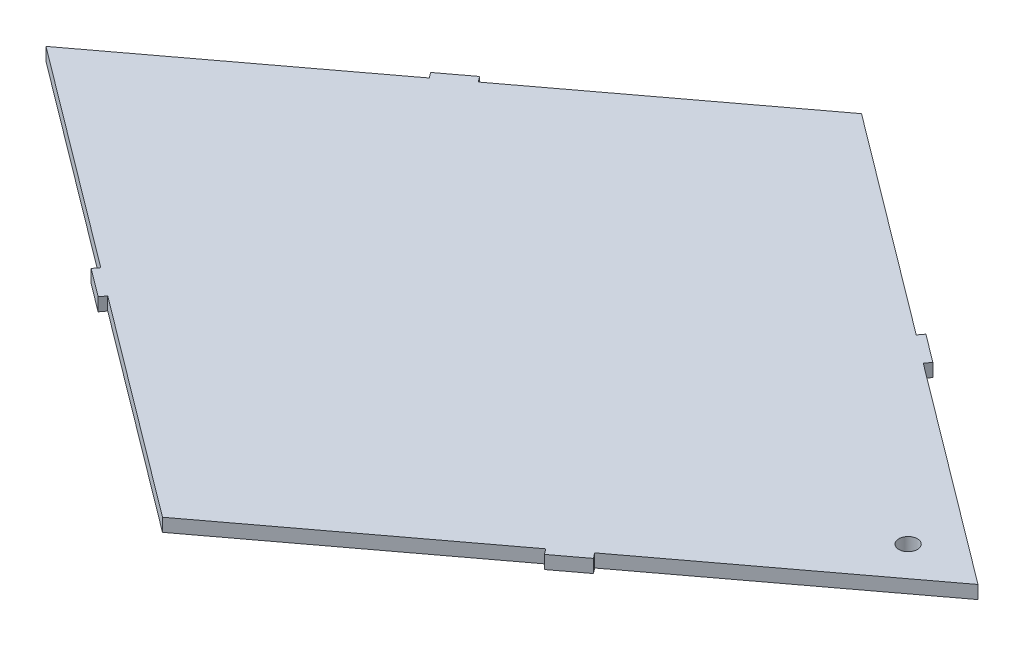
ISO-10303-21;
HEADER;
FILE_DESCRIPTION(('STEP AP214'),'2;1');
FILE_NAME('part.step','',(''),(''),'','','');
FILE_SCHEMA(('AUTOMOTIVE_DESIGN { 1 0 10303 214 1 1 1 1 }'));
ENDSEC;
DATA;
#1=APPLICATION_CONTEXT('core data for automotive mechanical design processes');
#2=APPLICATION_PROTOCOL_DEFINITION('international standard','automotive_design',2000,#1);
#3=PRODUCT_CONTEXT('',#1,'mechanical');
#4=PRODUCT('Part','Part','',(#3));
#5=PRODUCT_RELATED_PRODUCT_CATEGORY('part','',(#4));
#6=PRODUCT_DEFINITION_FORMATION('','',#4);
#7=PRODUCT_DEFINITION_CONTEXT('part definition',#1,'design');
#8=PRODUCT_DEFINITION('design','',#6,#7);
#9=PRODUCT_DEFINITION_SHAPE('','',#8);
#10=(LENGTH_UNIT() NAMED_UNIT(*) SI_UNIT(.MILLI.,.METRE.));
#11=(NAMED_UNIT(*) PLANE_ANGLE_UNIT() SI_UNIT($,.RADIAN.));
#12=(NAMED_UNIT(*) SI_UNIT($,.STERADIAN.) SOLID_ANGLE_UNIT());
#13=UNCERTAINTY_MEASURE_WITH_UNIT(LENGTH_MEASURE(1.E-05),#10,'distance_accuracy_value','');
#14=(GEOMETRIC_REPRESENTATION_CONTEXT(3) GLOBAL_UNCERTAINTY_ASSIGNED_CONTEXT((#13)) GLOBAL_UNIT_ASSIGNED_CONTEXT((#10,
#11,#12)) REPRESENTATION_CONTEXT('',''));
#15=CARTESIAN_POINT('',(0.,0.,0.));
#16=DIRECTION('',(0.,0.,1.));
#17=DIRECTION('',(1.,0.,0.));
#18=AXIS2_PLACEMENT_3D('',#15,#16,#17);
#19=CARTESIAN_POINT('',(0.,5.63,0.));
#20=DIRECTION('',(0.,1.,0.));
#21=DIRECTION('',(0.,0.,1.));
#22=AXIS2_PLACEMENT_3D('',#19,#20,#21);
#23=PLANE('',#22);
#24=DIRECTION('',(-0.8,0.,0.6));
#25=VECTOR('',#24,1.);
#26=CARTESIAN_POINT('',(-94.,5.63,-79.5));
#27=LINE('',#26,#25);
#28=CARTESIAN_POINT('',(0.,5.63,-150.));
#29=VERTEX_POINT('',#28);
#30=CARTESIAN_POINT('',(-94.,5.63,-79.5));
#31=VERTEX_POINT('',#30);
#32=EDGE_CURVE('E241',#29,#31,#27,.T.);
#33=ORIENTED_EDGE('',*,*,#32,.T.);
#34=DIRECTION('',(-0.599999999999997,0.,-0.800000000000002));
#35=VECTOR('',#34,1.);
#36=CARTESIAN_POINT('',(-95.77,5.63,-81.86));
#37=LINE('',#36,#35);
#38=CARTESIAN_POINT('',(-95.77,5.63,-81.86));
#39=VERTEX_POINT('',#38);
#40=EDGE_CURVE('E129',#31,#39,#37,.T.);
#41=ORIENTED_EDGE('',*,*,#40,.T.);
#42=DIRECTION('',(-0.8,0.,0.6));
#43=VECTOR('',#42,1.);
#44=CARTESIAN_POINT('',(-107.77,5.63,-72.86));
#45=LINE('',#44,#43);
#46=CARTESIAN_POINT('',(-107.77,5.63,-72.86));
#47=VERTEX_POINT('',#46);
#48=EDGE_CURVE('E292',#39,#47,#45,.T.);
#49=ORIENTED_EDGE('',*,*,#48,.T.);
#50=DIRECTION('',(0.599999999999986,0.,0.80000000000001));
#51=VECTOR('',#50,1.);
#52=CARTESIAN_POINT('',(-106.,5.63,-70.5));
#53=LINE('',#52,#51);
#54=CARTESIAN_POINT('',(-106.,5.63,-70.5));
#55=VERTEX_POINT('',#54);
#56=EDGE_CURVE('E311',#47,#55,#53,.T.);
#57=ORIENTED_EDGE('',*,*,#56,.T.);
#58=DIRECTION('',(-0.8,0.,0.6));
#59=VECTOR('',#58,1.);
#60=CARTESIAN_POINT('',(-200.,5.63,0.));
#61=LINE('',#60,#59);
#62=CARTESIAN_POINT('',(-200.,5.63,0.));
#63=VERTEX_POINT('',#62);
#64=EDGE_CURVE('E308',#55,#63,#61,.T.);
#65=ORIENTED_EDGE('',*,*,#64,.T.);
#66=DIRECTION('',(0.8,0.,0.6));
#67=VECTOR('',#66,1.);
#68=CARTESIAN_POINT('',(-106.,5.63,70.5));
#69=LINE('',#68,#67);
#70=CARTESIAN_POINT('',(-106.,5.63,70.5));
#71=VERTEX_POINT('',#70);
#72=EDGE_CURVE('E310',#63,#71,#69,.T.);
#73=ORIENTED_EDGE('',*,*,#72,.T.);
#74=DIRECTION('',(-0.599999999999998,0.,0.800000000000001));
#75=VECTOR('',#74,1.);
#76=CARTESIAN_POINT('',(-106.,5.63,70.5));
#77=LINE('',#76,#75);
#78=CARTESIAN_POINT('',(-107.769999999999,5.63,72.8599999999987));
#79=VERTEX_POINT('',#78);
#80=EDGE_CURVE('E313',#71,#79,#77,.T.);
#81=ORIENTED_EDGE('',*,*,#80,.T.);
#82=DIRECTION('',(0.8,0.,0.599999999999999));
#83=VECTOR('',#82,1.);
#84=CARTESIAN_POINT('',(-107.769999999999,5.63,72.8599999999987));
#85=LINE('',#84,#83);
#86=CARTESIAN_POINT('',(-95.769999999999,5.63,81.8599999999987));
#87=VERTEX_POINT('',#86);
#88=EDGE_CURVE('E319',#79,#87,#85,.T.);
#89=ORIENTED_EDGE('',*,*,#88,.T.);
#90=DIRECTION('',(0.599999999999999,0.,-0.800000000000001));
#91=VECTOR('',#90,1.);
#92=CARTESIAN_POINT('',(-95.769999999999,5.63,81.8599999999987));
#93=LINE('',#92,#91);
#94=CARTESIAN_POINT('',(-93.9999999999991,5.63,79.4999999999988));
#95=VERTEX_POINT('',#94);
#96=EDGE_CURVE('E321',#87,#95,#93,.T.);
#97=ORIENTED_EDGE('',*,*,#96,.T.);
#98=DIRECTION('',(0.799999999999992,0.,0.60000000000001));
#99=VECTOR('',#98,1.);
#100=CARTESIAN_POINT('',(0.,5.63,150.));
#101=LINE('',#100,#99);
#102=CARTESIAN_POINT('',(0.,5.63,150.));
#103=VERTEX_POINT('',#102);
#104=EDGE_CURVE('E323',#95,#103,#101,.T.);
#105=ORIENTED_EDGE('',*,*,#104,.T.);
#106=DIRECTION('',(0.8,0.,-0.6));
#107=VECTOR('',#106,1.);
#108=CARTESIAN_POINT('',(94.,5.63,79.5));
#109=LINE('',#108,#107);
#110=CARTESIAN_POINT('',(94.,5.63,79.5));
#111=VERTEX_POINT('',#110);
#112=EDGE_CURVE('E325',#103,#111,#109,.T.);
#113=ORIENTED_EDGE('',*,*,#112,.T.);
#114=DIRECTION('',(0.599999999999999,0.,0.8));
#115=VECTOR('',#114,1.);
#116=CARTESIAN_POINT('',(94.,5.63,79.5));
#117=LINE('',#116,#115);
#118=CARTESIAN_POINT('',(95.7699999999997,5.63,81.8599999999997));
#119=VERTEX_POINT('',#118);
#120=EDGE_CURVE('E327',#111,#119,#117,.T.);
#121=ORIENTED_EDGE('',*,*,#120,.T.);
#122=DIRECTION('',(0.8,0.,-0.6));
#123=VECTOR('',#122,1.);
#124=CARTESIAN_POINT('',(95.7699999999997,5.63,81.8599999999997));
#125=LINE('',#124,#123);
#126=CARTESIAN_POINT('',(107.77,5.63,72.8599999999997));
#127=VERTEX_POINT('',#126);
#128=EDGE_CURVE('E329',#119,#127,#125,.T.);
#129=ORIENTED_EDGE('',*,*,#128,.T.);
#130=DIRECTION('',(-0.600000000000006,0.,-0.799999999999995));
#131=VECTOR('',#130,1.);
#132=CARTESIAN_POINT('',(107.77,5.63,72.8599999999997));
#133=LINE('',#132,#131);
#134=CARTESIAN_POINT('',(106.,5.63,70.5000000000001));
#135=VERTEX_POINT('',#134);
#136=EDGE_CURVE('E331',#127,#135,#133,.T.);
#137=ORIENTED_EDGE('',*,*,#136,.T.);
#138=DIRECTION('',(0.8,0.,-0.600000000000001));
#139=VECTOR('',#138,1.);
#140=CARTESIAN_POINT('',(200.,5.63,0.));
#141=LINE('',#140,#139);
#142=CARTESIAN_POINT('',(200.,5.63,0.));
#143=VERTEX_POINT('',#142);
#144=EDGE_CURVE('E333',#135,#143,#141,.T.);
#145=ORIENTED_EDGE('',*,*,#144,.T.);
#146=DIRECTION('',(-0.8,0.,-0.6));
#147=VECTOR('',#146,1.);
#148=CARTESIAN_POINT('',(106.,5.63,-70.5));
#149=LINE('',#148,#147);
#150=CARTESIAN_POINT('',(106.,5.63,-70.5));
#151=VERTEX_POINT('',#150);
#152=EDGE_CURVE('E335',#143,#151,#149,.T.);
#153=ORIENTED_EDGE('',*,*,#152,.T.);
#154=DIRECTION('',(0.599999999999998,0.,-0.800000000000001));
#155=VECTOR('',#154,1.);
#156=CARTESIAN_POINT('',(107.77,5.63,-72.86));
#157=LINE('',#156,#155);
#158=CARTESIAN_POINT('',(107.77,5.63,-72.86));
#159=VERTEX_POINT('',#158);
#160=EDGE_CURVE('E184',#151,#159,#157,.T.);
#161=ORIENTED_EDGE('',*,*,#160,.T.);
#162=DIRECTION('',(-0.8,0.,-0.6));
#163=VECTOR('',#162,1.);
#164=CARTESIAN_POINT('',(95.7700000000001,5.63,-81.86));
#165=LINE('',#164,#163);
#166=CARTESIAN_POINT('',(95.7700000000001,5.63,-81.86));
#167=VERTEX_POINT('',#166);
#168=EDGE_CURVE('E178',#159,#167,#165,.T.);
#169=ORIENTED_EDGE('',*,*,#168,.T.);
#170=DIRECTION('',(-0.600000000000002,0.,0.799999999999999));
#171=VECTOR('',#170,1.);
#172=CARTESIAN_POINT('',(94.0000000000001,5.63,-79.5));
#173=LINE('',#172,#171);
#174=CARTESIAN_POINT('',(94.0000000000001,5.63,-79.5));
#175=VERTEX_POINT('',#174);
#176=EDGE_CURVE('E182',#167,#175,#173,.T.);
#177=ORIENTED_EDGE('',*,*,#176,.T.);
#178=DIRECTION('',(-0.8,0.,-0.6));
#179=VECTOR('',#178,1.);
#180=CARTESIAN_POINT('',(0.,5.63,-150.));
#181=LINE('',#180,#179);
#182=EDGE_CURVE('E50',#175,#29,#181,.T.);
#183=ORIENTED_EDGE('',*,*,#182,.T.);
#184=EDGE_LOOP('',(#33,#41,#49,#57,#65,#73,#81,#89,#97,#105,#113,#121,#129,#137,#145,#153,#161,
#169,#177,#183));
#185=FACE_BOUND('',#184,.T.);
#186=CARTESIAN_POINT('',(170.,5.63,0.));
#187=DIRECTION('',(0.,1.,0.));
#188=DIRECTION('',(0.,0.,1.));
#189=AXIS2_PLACEMENT_3D('',#186,#187,#188);
#190=CIRCLE('',#189,3.99999999999999);
#191=CARTESIAN_POINT('',(170.,5.63,4.));
#192=VERTEX_POINT('',#191);
#193=EDGE_CURVE('E206',#192,#192,#190,.T.);
#194=ORIENTED_EDGE('',*,*,#193,.F.);
#195=EDGE_LOOP('',(#194));
#196=FACE_BOUND('',#195,.T.);
#197=ADVANCED_FACE('F33',(#185,#196),#23,.T.);
#198=CARTESIAN_POINT('',(0.,0.,0.));
#199=DIRECTION('',(0.,1.,0.));
#200=DIRECTION('',(0.,0.,1.));
#201=AXIS2_PLACEMENT_3D('',#198,#199,#200);
#202=PLANE('',#201);
#203=DIRECTION('',(-0.8,0.,0.6));
#204=VECTOR('',#203,1.);
#205=CARTESIAN_POINT('',(-94.,0.,-79.5));
#206=LINE('',#205,#204);
#207=CARTESIAN_POINT('',(0.,0.,-150.));
#208=VERTEX_POINT('',#207);
#209=CARTESIAN_POINT('',(-94.,0.,-79.5));
#210=VERTEX_POINT('',#209);
#211=EDGE_CURVE('E202',#208,#210,#206,.T.);
#212=ORIENTED_EDGE('',*,*,#211,.F.);
#213=DIRECTION('',(-0.8,0.,-0.6));
#214=VECTOR('',#213,1.);
#215=CARTESIAN_POINT('',(0.,0.,-150.));
#216=LINE('',#215,#214);
#217=CARTESIAN_POINT('',(94.0000000000001,0.,-79.5));
#218=VERTEX_POINT('',#217);
#219=EDGE_CURVE('E121',#218,#208,#216,.T.);
#220=ORIENTED_EDGE('',*,*,#219,.F.);
#221=DIRECTION('',(-0.600000000000002,0.,0.799999999999999));
#222=VECTOR('',#221,1.);
#223=CARTESIAN_POINT('',(94.0000000000001,0.,-79.5));
#224=LINE('',#223,#222);
#225=CARTESIAN_POINT('',(95.7700000000001,0.,-81.86));
#226=VERTEX_POINT('',#225);
#227=EDGE_CURVE('E115',#226,#218,#224,.T.);
#228=ORIENTED_EDGE('',*,*,#227,.F.);
#229=DIRECTION('',(-0.8,0.,-0.6));
#230=VECTOR('',#229,1.);
#231=CARTESIAN_POINT('',(95.7700000000001,0.,-81.86));
#232=LINE('',#231,#230);
#233=CARTESIAN_POINT('',(107.77,0.,-72.86));
#234=VERTEX_POINT('',#233);
#235=EDGE_CURVE('E192',#234,#226,#232,.T.);
#236=ORIENTED_EDGE('',*,*,#235,.F.);
#237=DIRECTION('',(0.599999999999998,0.,-0.800000000000001));
#238=VECTOR('',#237,1.);
#239=CARTESIAN_POINT('',(107.77,0.,-72.86));
#240=LINE('',#239,#238);
#241=CARTESIAN_POINT('',(106.,0.,-70.5));
#242=VERTEX_POINT('',#241);
#243=EDGE_CURVE('E236',#242,#234,#240,.T.);
#244=ORIENTED_EDGE('',*,*,#243,.F.);
#245=DIRECTION('',(-0.8,0.,-0.6));
#246=VECTOR('',#245,1.);
#247=CARTESIAN_POINT('',(106.,0.,-70.5));
#248=LINE('',#247,#246);
#249=CARTESIAN_POINT('',(200.,0.,0.));
#250=VERTEX_POINT('',#249);
#251=EDGE_CURVE('E234',#250,#242,#248,.T.);
#252=ORIENTED_EDGE('',*,*,#251,.F.);
#253=DIRECTION('',(0.8,0.,-0.600000000000001));
#254=VECTOR('',#253,1.);
#255=CARTESIAN_POINT('',(200.,0.,0.));
#256=LINE('',#255,#254);
#257=CARTESIAN_POINT('',(106.,0.,70.5000000000001));
#258=VERTEX_POINT('',#257);
#259=EDGE_CURVE('E232',#258,#250,#256,.T.);
#260=ORIENTED_EDGE('',*,*,#259,.F.);
#261=DIRECTION('',(-0.600000000000006,0.,-0.799999999999995));
#262=VECTOR('',#261,1.);
#263=CARTESIAN_POINT('',(107.77,0.,72.8599999999997));
#264=LINE('',#263,#262);
#265=CARTESIAN_POINT('',(107.77,0.,72.8599999999997));
#266=VERTEX_POINT('',#265);
#267=EDGE_CURVE('E230',#266,#258,#264,.T.);
#268=ORIENTED_EDGE('',*,*,#267,.F.);
#269=DIRECTION('',(0.8,0.,-0.6));
#270=VECTOR('',#269,1.);
#271=CARTESIAN_POINT('',(95.7699999999997,0.,81.8599999999997));
#272=LINE('',#271,#270);
#273=CARTESIAN_POINT('',(95.7699999999997,0.,81.8599999999997));
#274=VERTEX_POINT('',#273);
#275=EDGE_CURVE('E228',#274,#266,#272,.T.);
#276=ORIENTED_EDGE('',*,*,#275,.F.);
#277=DIRECTION('',(0.599999999999999,0.,0.8));
#278=VECTOR('',#277,1.);
#279=CARTESIAN_POINT('',(94.,0.,79.5));
#280=LINE('',#279,#278);
#281=CARTESIAN_POINT('',(94.,0.,79.5));
#282=VERTEX_POINT('',#281);
#283=EDGE_CURVE('E226',#282,#274,#280,.T.);
#284=ORIENTED_EDGE('',*,*,#283,.F.);
#285=DIRECTION('',(0.8,0.,-0.6));
#286=VECTOR('',#285,1.);
#287=CARTESIAN_POINT('',(94.,0.,79.5));
#288=LINE('',#287,#286);
#289=CARTESIAN_POINT('',(0.,0.,150.));
#290=VERTEX_POINT('',#289);
#291=EDGE_CURVE('E224',#290,#282,#288,.T.);
#292=ORIENTED_EDGE('',*,*,#291,.F.);
#293=DIRECTION('',(0.799999999999992,0.,0.60000000000001));
#294=VECTOR('',#293,1.);
#295=CARTESIAN_POINT('',(0.,0.,150.));
#296=LINE('',#295,#294);
#297=CARTESIAN_POINT('',(-93.9999999999991,0.,79.4999999999988));
#298=VERTEX_POINT('',#297);
#299=EDGE_CURVE('E222',#298,#290,#296,.T.);
#300=ORIENTED_EDGE('',*,*,#299,.F.);
#301=DIRECTION('',(0.599999999999999,0.,-0.800000000000001));
#302=VECTOR('',#301,1.);
#303=CARTESIAN_POINT('',(-95.769999999999,0.,81.8599999999987));
#304=LINE('',#303,#302);
#305=CARTESIAN_POINT('',(-95.769999999999,0.,81.8599999999987));
#306=VERTEX_POINT('',#305);
#307=EDGE_CURVE('E220',#306,#298,#304,.T.);
#308=ORIENTED_EDGE('',*,*,#307,.F.);
#309=DIRECTION('',(0.8,0.,0.599999999999999));
#310=VECTOR('',#309,1.);
#311=CARTESIAN_POINT('',(-107.769999999999,0.,72.8599999999987));
#312=LINE('',#311,#310);
#313=CARTESIAN_POINT('',(-107.769999999999,0.,72.8599999999987));
#314=VERTEX_POINT('',#313);
#315=EDGE_CURVE('E218',#314,#306,#312,.T.);
#316=ORIENTED_EDGE('',*,*,#315,.F.);
#317=DIRECTION('',(-0.599999999999998,0.,0.800000000000001));
#318=VECTOR('',#317,1.);
#319=CARTESIAN_POINT('',(-106.,0.,70.5));
#320=LINE('',#319,#318);
#321=CARTESIAN_POINT('',(-106.,0.,70.5));
#322=VERTEX_POINT('',#321);
#323=EDGE_CURVE('E216',#322,#314,#320,.T.);
#324=ORIENTED_EDGE('',*,*,#323,.F.);
#325=DIRECTION('',(0.8,0.,0.6));
#326=VECTOR('',#325,1.);
#327=CARTESIAN_POINT('',(-106.,0.,70.5));
#328=LINE('',#327,#326);
#329=CARTESIAN_POINT('',(-200.,0.,0.));
#330=VERTEX_POINT('',#329);
#331=EDGE_CURVE('E214',#330,#322,#328,.T.);
#332=ORIENTED_EDGE('',*,*,#331,.F.);
#333=DIRECTION('',(-0.8,0.,0.6));
#334=VECTOR('',#333,1.);
#335=CARTESIAN_POINT('',(-200.,0.,0.));
#336=LINE('',#335,#334);
#337=CARTESIAN_POINT('',(-106.,0.,-70.5));
#338=VERTEX_POINT('',#337);
#339=EDGE_CURVE('E212',#338,#330,#336,.T.);
#340=ORIENTED_EDGE('',*,*,#339,.F.);
#341=DIRECTION('',(0.599999999999986,0.,0.80000000000001));
#342=VECTOR('',#341,1.);
#343=CARTESIAN_POINT('',(-106.,0.,-70.5));
#344=LINE('',#343,#342);
#345=CARTESIAN_POINT('',(-107.77,0.,-72.86));
#346=VERTEX_POINT('',#345);
#347=EDGE_CURVE('E210',#346,#338,#344,.T.);
#348=ORIENTED_EDGE('',*,*,#347,.F.);
#349=DIRECTION('',(-0.8,0.,0.6));
#350=VECTOR('',#349,1.);
#351=CARTESIAN_POINT('',(-107.77,0.,-72.86));
#352=LINE('',#351,#350);
#353=CARTESIAN_POINT('',(-95.77,0.,-81.86));
#354=VERTEX_POINT('',#353);
#355=EDGE_CURVE('E208',#354,#346,#352,.T.);
#356=ORIENTED_EDGE('',*,*,#355,.F.);
#357=DIRECTION('',(-0.599999999999997,0.,-0.800000000000002));
#358=VECTOR('',#357,1.);
#359=CARTESIAN_POINT('',(-95.77,0.,-81.86));
#360=LINE('',#359,#358);
#361=EDGE_CURVE('E205',#210,#354,#360,.T.);
#362=ORIENTED_EDGE('',*,*,#361,.F.);
#363=EDGE_LOOP('',(#212,#220,#228,#236,#244,#252,#260,#268,#276,#284,#292,#300,#308,#316,#324,
#332,#340,#348,#356,#362));
#364=FACE_BOUND('',#363,.T.);
#365=CARTESIAN_POINT('',(170.,0.,0.));
#366=DIRECTION('',(0.,1.,0.));
#367=DIRECTION('',(0.,0.,1.));
#368=AXIS2_PLACEMENT_3D('',#365,#366,#367);
#369=CIRCLE('',#368,3.99999999999999);
#370=CARTESIAN_POINT('',(170.,0.,4.));
#371=VERTEX_POINT('',#370);
#372=EDGE_CURVE('E586',#371,#371,#369,.T.);
#373=ORIENTED_EDGE('',*,*,#372,.T.);
#374=EDGE_LOOP('',(#373));
#375=FACE_BOUND('',#374,.T.);
#376=ADVANCED_FACE('F296',(#364,#375),#202,.F.);
#377=CARTESIAN_POINT('',(-94.,5.63,-79.5));
#378=DIRECTION('',(0.6,0.,0.8));
#379=DIRECTION('',(0.8,0.,-0.6));
#380=AXIS2_PLACEMENT_3D('',#377,#378,#379);
#381=PLANE('',#380);
#382=ORIENTED_EDGE('',*,*,#211,.T.);
#383=DIRECTION('',(0.,-1.,0.));
#384=VECTOR('',#383,1.);
#385=CARTESIAN_POINT('',(-94.,5.63,-79.5));
#386=LINE('',#385,#384);
#387=EDGE_CURVE('E11',#31,#210,#386,.T.);
#388=ORIENTED_EDGE('',*,*,#387,.F.);
#389=ORIENTED_EDGE('',*,*,#32,.F.);
#390=DIRECTION('',(0.,-1.,0.));
#391=VECTOR('',#390,1.);
#392=CARTESIAN_POINT('',(0.,5.63,-150.));
#393=LINE('',#392,#391);
#394=EDGE_CURVE('E198',#29,#208,#393,.T.);
#395=ORIENTED_EDGE('',*,*,#394,.T.);
#396=EDGE_LOOP('',(#382,#388,#389,#395));
#397=FACE_BOUND('',#396,.T.);
#398=ADVANCED_FACE('F35',(#397),#381,.F.);
#399=CARTESIAN_POINT('',(-95.77,5.63,-81.86));
#400=DIRECTION('',(-0.800000000000002,0.,0.599999999999997));
#401=DIRECTION('',(0.599999999999997,0.,0.800000000000002));
#402=AXIS2_PLACEMENT_3D('',#399,#400,#401);
#403=PLANE('',#402);
#404=ORIENTED_EDGE('',*,*,#361,.T.);
#405=DIRECTION('',(0.,-1.,0.));
#406=VECTOR('',#405,1.);
#407=CARTESIAN_POINT('',(-95.77,5.63,-81.86));
#408=LINE('',#407,#406);
#409=EDGE_CURVE('E42',#39,#354,#408,.T.);
#410=ORIENTED_EDGE('',*,*,#409,.F.);
#411=ORIENTED_EDGE('',*,*,#40,.F.);
#412=ORIENTED_EDGE('',*,*,#387,.T.);
#413=EDGE_LOOP('',(#404,#410,#411,#412));
#414=FACE_BOUND('',#413,.T.);
#415=ADVANCED_FACE('F369',(#414),#403,.F.);
#416=CARTESIAN_POINT('',(-107.77,5.63,-72.86));
#417=DIRECTION('',(0.6,0.,0.8));
#418=DIRECTION('',(0.8,0.,-0.6));
#419=AXIS2_PLACEMENT_3D('',#416,#417,#418);
#420=PLANE('',#419);
#421=ORIENTED_EDGE('',*,*,#355,.T.);
#422=DIRECTION('',(0.,-1.,0.));
#423=VECTOR('',#422,1.);
#424=CARTESIAN_POINT('',(-107.77,5.63,-72.86));
#425=LINE('',#424,#423);
#426=EDGE_CURVE('E284',#47,#346,#425,.T.);
#427=ORIENTED_EDGE('',*,*,#426,.F.);
#428=ORIENTED_EDGE('',*,*,#48,.F.);
#429=ORIENTED_EDGE('',*,*,#409,.T.);
#430=EDGE_LOOP('',(#421,#427,#428,#429));
#431=FACE_BOUND('',#430,.T.);
#432=ADVANCED_FACE('F290',(#431),#420,.F.);
#433=CARTESIAN_POINT('',(-106.,5.63,-70.5));
#434=DIRECTION('',(0.80000000000001,0.,-0.599999999999986));
#435=DIRECTION('',(-0.599999999999986,0.,-0.80000000000001));
#436=AXIS2_PLACEMENT_3D('',#433,#434,#435);
#437=PLANE('',#436);
#438=ORIENTED_EDGE('',*,*,#347,.T.);
#439=DIRECTION('',(0.,-1.,0.));
#440=VECTOR('',#439,1.);
#441=CARTESIAN_POINT('',(-106.,5.63,-70.5));
#442=LINE('',#441,#440);
#443=EDGE_CURVE('E281',#55,#338,#442,.T.);
#444=ORIENTED_EDGE('',*,*,#443,.F.);
#445=ORIENTED_EDGE('',*,*,#56,.F.);
#446=ORIENTED_EDGE('',*,*,#426,.T.);
#447=EDGE_LOOP('',(#438,#444,#445,#446));
#448=FACE_BOUND('',#447,.T.);
#449=ADVANCED_FACE('F302',(#448),#437,.F.);
#450=CARTESIAN_POINT('',(-200.,5.63,0.));
#451=DIRECTION('',(0.6,0.,0.8));
#452=DIRECTION('',(0.8,0.,-0.6));
#453=AXIS2_PLACEMENT_3D('',#450,#451,#452);
#454=PLANE('',#453);
#455=ORIENTED_EDGE('',*,*,#339,.T.);
#456=DIRECTION('',(0.,-1.,0.));
#457=VECTOR('',#456,1.);
#458=CARTESIAN_POINT('',(-200.,5.63,0.));
#459=LINE('',#458,#457);
#460=EDGE_CURVE('E278',#63,#330,#459,.T.);
#461=ORIENTED_EDGE('',*,*,#460,.F.);
#462=ORIENTED_EDGE('',*,*,#64,.F.);
#463=ORIENTED_EDGE('',*,*,#443,.T.);
#464=EDGE_LOOP('',(#455,#461,#462,#463));
#465=FACE_BOUND('',#464,.T.);
#466=ADVANCED_FACE('F306',(#465),#454,.F.);
#467=CARTESIAN_POINT('',(-106.,5.63,70.5));
#468=DIRECTION('',(0.6,0.,-0.8));
#469=DIRECTION('',(-0.8,0.,-0.6));
#470=AXIS2_PLACEMENT_3D('',#467,#468,#469);
#471=PLANE('',#470);
#472=ORIENTED_EDGE('',*,*,#331,.T.);
#473=DIRECTION('',(0.,-1.,0.));
#474=VECTOR('',#473,1.);
#475=CARTESIAN_POINT('',(-106.,5.63,70.5));
#476=LINE('',#475,#474);
#477=EDGE_CURVE('E275',#71,#322,#476,.T.);
#478=ORIENTED_EDGE('',*,*,#477,.F.);
#479=ORIENTED_EDGE('',*,*,#72,.F.);
#480=ORIENTED_EDGE('',*,*,#460,.T.);
#481=EDGE_LOOP('',(#472,#478,#479,#480));
#482=FACE_BOUND('',#481,.T.);
#483=ADVANCED_FACE('F382',(#482),#471,.F.);
#484=CARTESIAN_POINT('',(-106.,5.63,70.5));
#485=DIRECTION('',(0.800000000000001,0.,0.599999999999999));
#486=DIRECTION('',(0.599999999999999,0.,-0.800000000000001));
#487=AXIS2_PLACEMENT_3D('',#484,#485,#486);
#488=PLANE('',#487);
#489=ORIENTED_EDGE('',*,*,#323,.T.);
#490=DIRECTION('',(0.,-1.,0.));
#491=VECTOR('',#490,1.);
#492=CARTESIAN_POINT('',(-107.769999999999,5.63,72.8599999999987));
#493=LINE('',#492,#491);
#494=EDGE_CURVE('E272',#79,#314,#493,.T.);
#495=ORIENTED_EDGE('',*,*,#494,.F.);
#496=ORIENTED_EDGE('',*,*,#80,.F.);
#497=ORIENTED_EDGE('',*,*,#477,.T.);
#498=EDGE_LOOP('',(#489,#495,#496,#497));
#499=FACE_BOUND('',#498,.T.);
#500=ADVANCED_FACE('F385',(#499),#488,.F.);
#501=CARTESIAN_POINT('',(-107.769999999999,5.63,72.8599999999987));
#502=DIRECTION('',(0.599999999999999,0.,-0.8));
#503=DIRECTION('',(-0.800000000000001,0.,-0.6));
#504=AXIS2_PLACEMENT_3D('',#501,#502,#503);
#505=PLANE('',#504);
#506=ORIENTED_EDGE('',*,*,#315,.T.);
#507=DIRECTION('',(0.,-1.,0.));
#508=VECTOR('',#507,1.);
#509=CARTESIAN_POINT('',(-95.769999999999,5.63,81.8599999999987));
#510=LINE('',#509,#508);
#511=EDGE_CURVE('E269',#87,#306,#510,.T.);
#512=ORIENTED_EDGE('',*,*,#511,.F.);
#513=ORIENTED_EDGE('',*,*,#88,.F.);
#514=ORIENTED_EDGE('',*,*,#494,.T.);
#515=EDGE_LOOP('',(#506,#512,#513,#514));
#516=FACE_BOUND('',#515,.T.);
#517=ADVANCED_FACE('F389',(#516),#505,.F.);
#518=CARTESIAN_POINT('',(-95.769999999999,5.63,81.8599999999987));
#519=DIRECTION('',(-0.800000000000001,0.,-0.599999999999999));
#520=DIRECTION('',(-0.599999999999999,0.,0.800000000000001));
#521=AXIS2_PLACEMENT_3D('',#518,#519,#520);
#522=PLANE('',#521);
#523=ORIENTED_EDGE('',*,*,#307,.T.);
#524=DIRECTION('',(0.,-1.,0.));
#525=VECTOR('',#524,1.);
#526=CARTESIAN_POINT('',(-93.9999999999991,5.63,79.4999999999988));
#527=LINE('',#526,#525);
#528=EDGE_CURVE('E266',#95,#298,#527,.T.);
#529=ORIENTED_EDGE('',*,*,#528,.F.);
#530=ORIENTED_EDGE('',*,*,#96,.F.);
#531=ORIENTED_EDGE('',*,*,#511,.T.);
#532=EDGE_LOOP('',(#523,#529,#530,#531));
#533=FACE_BOUND('',#532,.T.);
#534=ADVANCED_FACE('F393',(#533),#522,.F.);
#535=CARTESIAN_POINT('',(0.,5.63,150.));
#536=DIRECTION('',(0.60000000000001,0.,-0.799999999999992));
#537=DIRECTION('',(-0.799999999999993,0.,-0.60000000000001));
#538=AXIS2_PLACEMENT_3D('',#535,#536,#537);
#539=PLANE('',#538);
#540=ORIENTED_EDGE('',*,*,#299,.T.);
#541=DIRECTION('',(0.,-1.,0.));
#542=VECTOR('',#541,1.);
#543=CARTESIAN_POINT('',(0.,5.63,150.));
#544=LINE('',#543,#542);
#545=EDGE_CURVE('E263',#103,#290,#544,.T.);
#546=ORIENTED_EDGE('',*,*,#545,.F.);
#547=ORIENTED_EDGE('',*,*,#104,.F.);
#548=ORIENTED_EDGE('',*,*,#528,.T.);
#549=EDGE_LOOP('',(#540,#546,#547,#548));
#550=FACE_BOUND('',#549,.T.);
#551=ADVANCED_FACE('F397',(#550),#539,.F.);
#552=CARTESIAN_POINT('',(94.,5.63,79.5));
#553=DIRECTION('',(-0.6,0.,-0.8));
#554=DIRECTION('',(-0.8,0.,0.6));
#555=AXIS2_PLACEMENT_3D('',#552,#553,#554);
#556=PLANE('',#555);
#557=ORIENTED_EDGE('',*,*,#291,.T.);
#558=DIRECTION('',(0.,-1.,0.));
#559=VECTOR('',#558,1.);
#560=CARTESIAN_POINT('',(94.,5.63,79.5));
#561=LINE('',#560,#559);
#562=EDGE_CURVE('E260',#111,#282,#561,.T.);
#563=ORIENTED_EDGE('',*,*,#562,.F.);
#564=ORIENTED_EDGE('',*,*,#112,.F.);
#565=ORIENTED_EDGE('',*,*,#545,.T.);
#566=EDGE_LOOP('',(#557,#563,#564,#565));
#567=FACE_BOUND('',#566,.T.);
#568=ADVANCED_FACE('F401',(#567),#556,.F.);
#569=CARTESIAN_POINT('',(94.,5.63,79.5));
#570=DIRECTION('',(0.800000000000001,0.,-0.599999999999999));
#571=DIRECTION('',(-0.599999999999999,0.,-0.800000000000001));
#572=AXIS2_PLACEMENT_3D('',#569,#570,#571);
#573=PLANE('',#572);
#574=ORIENTED_EDGE('',*,*,#283,.T.);
#575=DIRECTION('',(0.,-1.,0.));
#576=VECTOR('',#575,1.);
#577=CARTESIAN_POINT('',(95.7699999999997,5.63,81.8599999999997));
#578=LINE('',#577,#576);
#579=EDGE_CURVE('E257',#119,#274,#578,.T.);
#580=ORIENTED_EDGE('',*,*,#579,.F.);
#581=ORIENTED_EDGE('',*,*,#120,.F.);
#582=ORIENTED_EDGE('',*,*,#562,.T.);
#583=EDGE_LOOP('',(#574,#580,#581,#582));
#584=FACE_BOUND('',#583,.T.);
#585=ADVANCED_FACE('F405',(#584),#573,.F.);
#586=CARTESIAN_POINT('',(95.7699999999997,5.63,81.8599999999997));
#587=DIRECTION('',(-0.6,0.,-0.8));
#588=DIRECTION('',(-0.8,0.,0.6));
#589=AXIS2_PLACEMENT_3D('',#586,#587,#588);
#590=PLANE('',#589);
#591=ORIENTED_EDGE('',*,*,#275,.T.);
#592=DIRECTION('',(0.,-1.,0.));
#593=VECTOR('',#592,1.);
#594=CARTESIAN_POINT('',(107.77,5.63,72.8599999999997));
#595=LINE('',#594,#593);
#596=EDGE_CURVE('E254',#127,#266,#595,.T.);
#597=ORIENTED_EDGE('',*,*,#596,.F.);
#598=ORIENTED_EDGE('',*,*,#128,.F.);
#599=ORIENTED_EDGE('',*,*,#579,.T.);
#600=EDGE_LOOP('',(#591,#597,#598,#599));
#601=FACE_BOUND('',#600,.T.);
#602=ADVANCED_FACE('F409',(#601),#590,.F.);
#603=CARTESIAN_POINT('',(107.77,5.63,72.8599999999997));
#604=DIRECTION('',(-0.799999999999995,0.,0.600000000000006));
#605=DIRECTION('',(0.600000000000006,0.,0.799999999999995));
#606=AXIS2_PLACEMENT_3D('',#603,#604,#605);
#607=PLANE('',#606);
#608=ORIENTED_EDGE('',*,*,#267,.T.);
#609=DIRECTION('',(0.,-1.,0.));
#610=VECTOR('',#609,1.);
#611=CARTESIAN_POINT('',(106.,5.63,70.5000000000001));
#612=LINE('',#611,#610);
#613=EDGE_CURVE('E251',#135,#258,#612,.T.);
#614=ORIENTED_EDGE('',*,*,#613,.F.);
#615=ORIENTED_EDGE('',*,*,#136,.F.);
#616=ORIENTED_EDGE('',*,*,#596,.T.);
#617=EDGE_LOOP('',(#608,#614,#615,#616));
#618=FACE_BOUND('',#617,.T.);
#619=ADVANCED_FACE('F413',(#618),#607,.F.);
#620=CARTESIAN_POINT('',(200.,5.63,0.));
#621=DIRECTION('',(-0.600000000000001,0.,-0.8));
#622=DIRECTION('',(-0.8,0.,0.600000000000001));
#623=AXIS2_PLACEMENT_3D('',#620,#621,#622);
#624=PLANE('',#623);
#625=ORIENTED_EDGE('',*,*,#259,.T.);
#626=DIRECTION('',(0.,-1.,0.));
#627=VECTOR('',#626,1.);
#628=CARTESIAN_POINT('',(200.,5.63,0.));
#629=LINE('',#628,#627);
#630=EDGE_CURVE('E248',#143,#250,#629,.T.);
#631=ORIENTED_EDGE('',*,*,#630,.F.);
#632=ORIENTED_EDGE('',*,*,#144,.F.);
#633=ORIENTED_EDGE('',*,*,#613,.T.);
#634=EDGE_LOOP('',(#625,#631,#632,#633));
#635=FACE_BOUND('',#634,.T.);
#636=ADVANCED_FACE('F417',(#635),#624,.F.);
#637=CARTESIAN_POINT('',(106.,5.63,-70.5));
#638=DIRECTION('',(-0.6,0.,0.8));
#639=DIRECTION('',(0.8,0.,0.6));
#640=AXIS2_PLACEMENT_3D('',#637,#638,#639);
#641=PLANE('',#640);
#642=ORIENTED_EDGE('',*,*,#251,.T.);
#643=DIRECTION('',(0.,-1.,0.));
#644=VECTOR('',#643,1.);
#645=CARTESIAN_POINT('',(106.,5.63,-70.5));
#646=LINE('',#645,#644);
#647=EDGE_CURVE('E245',#151,#242,#646,.T.);
#648=ORIENTED_EDGE('',*,*,#647,.F.);
#649=ORIENTED_EDGE('',*,*,#152,.F.);
#650=ORIENTED_EDGE('',*,*,#630,.T.);
#651=EDGE_LOOP('',(#642,#648,#649,#650));
#652=FACE_BOUND('',#651,.T.);
#653=ADVANCED_FACE('F341',(#652),#641,.F.);
#654=CARTESIAN_POINT('',(107.77,5.63,-72.86));
#655=DIRECTION('',(-0.800000000000001,0.,-0.599999999999999));
#656=DIRECTION('',(-0.599999999999999,0.,0.800000000000001));
#657=AXIS2_PLACEMENT_3D('',#654,#655,#656);
#658=PLANE('',#657);
#659=ORIENTED_EDGE('',*,*,#243,.T.);
#660=DIRECTION('',(0.,-1.,0.));
#661=VECTOR('',#660,1.);
#662=CARTESIAN_POINT('',(107.77,5.63,-72.86));
#663=LINE('',#662,#661);
#664=EDGE_CURVE('E193',#159,#234,#663,.T.);
#665=ORIENTED_EDGE('',*,*,#664,.F.);
#666=ORIENTED_EDGE('',*,*,#160,.F.);
#667=ORIENTED_EDGE('',*,*,#647,.T.);
#668=EDGE_LOOP('',(#659,#665,#666,#667));
#669=FACE_BOUND('',#668,.T.);
#670=ADVANCED_FACE('F345',(#669),#658,.F.);
#671=CARTESIAN_POINT('',(95.7700000000001,5.63,-81.86));
#672=DIRECTION('',(-0.6,0.,0.8));
#673=DIRECTION('',(0.8,0.,0.6));
#674=AXIS2_PLACEMENT_3D('',#671,#672,#673);
#675=PLANE('',#674);
#676=ORIENTED_EDGE('',*,*,#235,.T.);
#677=DIRECTION('',(0.,-1.,0.));
#678=VECTOR('',#677,1.);
#679=CARTESIAN_POINT('',(95.7700000000001,5.63,-81.86));
#680=LINE('',#679,#678);
#681=EDGE_CURVE('E189',#167,#226,#680,.T.);
#682=ORIENTED_EDGE('',*,*,#681,.F.);
#683=ORIENTED_EDGE('',*,*,#168,.F.);
#684=ORIENTED_EDGE('',*,*,#664,.T.);
#685=EDGE_LOOP('',(#676,#682,#683,#684));
#686=FACE_BOUND('',#685,.T.);
#687=ADVANCED_FACE('F190',(#686),#675,.F.);
#688=CARTESIAN_POINT('',(94.0000000000001,5.63,-79.5));
#689=DIRECTION('',(0.799999999999999,0.,0.600000000000002));
#690=DIRECTION('',(0.600000000000002,0.,-0.799999999999999));
#691=AXIS2_PLACEMENT_3D('',#688,#689,#690);
#692=PLANE('',#691);
#693=ORIENTED_EDGE('',*,*,#227,.T.);
#694=DIRECTION('',(0.,-1.,0.));
#695=VECTOR('',#694,1.);
#696=CARTESIAN_POINT('',(94.0000000000001,5.63,-79.5));
#697=LINE('',#696,#695);
#698=EDGE_CURVE('E194',#175,#218,#697,.T.);
#699=ORIENTED_EDGE('',*,*,#698,.F.);
#700=ORIENTED_EDGE('',*,*,#176,.F.);
#701=ORIENTED_EDGE('',*,*,#681,.T.);
#702=EDGE_LOOP('',(#693,#699,#700,#701));
#703=FACE_BOUND('',#702,.T.);
#704=ADVANCED_FACE('F196',(#703),#692,.F.);
#705=CARTESIAN_POINT('',(0.,5.63,-150.));
#706=DIRECTION('',(-0.6,0.,0.8));
#707=DIRECTION('',(0.8,0.,0.6));
#708=AXIS2_PLACEMENT_3D('',#705,#706,#707);
#709=PLANE('',#708);
#710=ORIENTED_EDGE('',*,*,#219,.T.);
#711=ORIENTED_EDGE('',*,*,#394,.F.);
#712=ORIENTED_EDGE('',*,*,#182,.F.);
#713=ORIENTED_EDGE('',*,*,#698,.T.);
#714=EDGE_LOOP('',(#710,#711,#712,#713));
#715=FACE_BOUND('',#714,.T.);
#716=ADVANCED_FACE('F349',(#715),#709,.F.);
#717=CARTESIAN_POINT('',(170.,5.63,0.));
#718=DIRECTION('',(0.,-1.,0.));
#719=DIRECTION('',(0.,0.,-1.));
#720=AXIS2_PLACEMENT_3D('',#717,#718,#719);
#721=CYLINDRICAL_SURFACE('',#720,3.99999999999999);
#722=ORIENTED_EDGE('',*,*,#193,.T.);
#723=EDGE_LOOP('',(#722));
#724=FACE_BOUND('',#723,.T.);
#725=ORIENTED_EDGE('',*,*,#372,.F.);
#726=EDGE_LOOP('',(#725));
#727=FACE_BOUND('',#726,.T.);
#728=ADVANCED_FACE('F351',(#724,#727),#721,.F.);
#729=CLOSED_SHELL('',(#197,#376,#398,#415,#432,#449,#466,#483,#500,#517,#534,#551,#568,#585,
#602,#619,#636,#653,#670,#687,#704,#716,#728));
#730=MANIFOLD_SOLID_BREP('B2',#729);
#731=ADVANCED_BREP_SHAPE_REPRESENTATION('',(#18,#730),#14);
#732=SHAPE_DEFINITION_REPRESENTATION(#9,#731);
ENDSEC;
END-ISO-10303-21;
